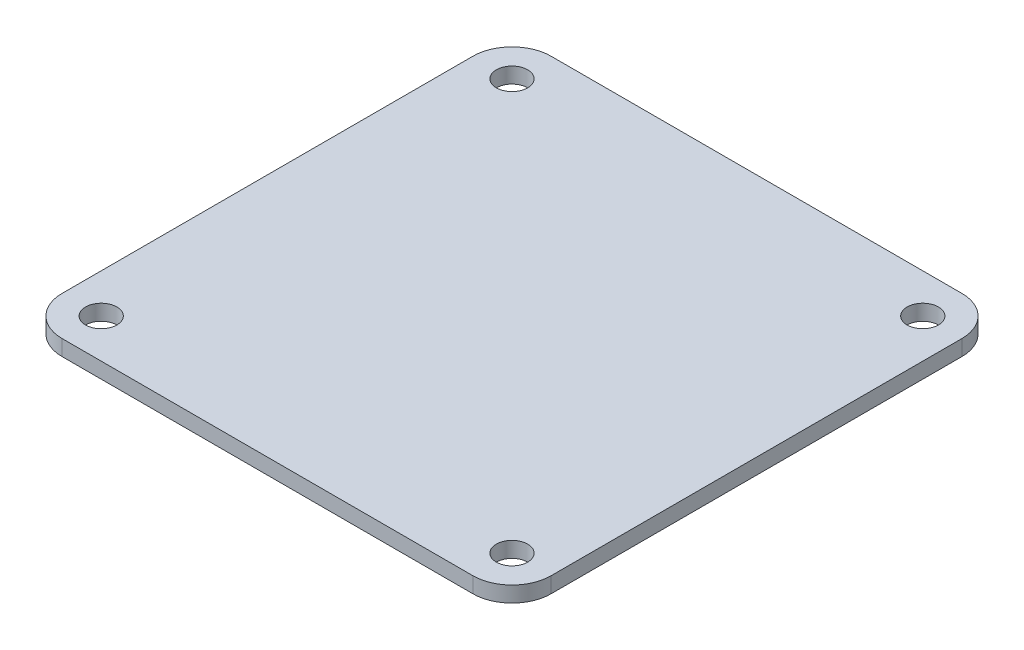
ISO-10303-21;
HEADER;
FILE_DESCRIPTION(('STEP AP214'),'2;1');
FILE_NAME('part.step','',(''),(''),'','','');
FILE_SCHEMA(('AUTOMOTIVE_DESIGN { 1 0 10303 214 1 1 1 1 }'));
ENDSEC;
DATA;
#1=APPLICATION_CONTEXT('core data for automotive mechanical design processes');
#2=APPLICATION_PROTOCOL_DEFINITION('international standard','automotive_design',2000,#1);
#3=PRODUCT_CONTEXT('',#1,'mechanical');
#4=PRODUCT('Part','Part','',(#3));
#5=PRODUCT_RELATED_PRODUCT_CATEGORY('part','',(#4));
#6=PRODUCT_DEFINITION_FORMATION('','',#4);
#7=PRODUCT_DEFINITION_CONTEXT('part definition',#1,'design');
#8=PRODUCT_DEFINITION('design','',#6,#7);
#9=PRODUCT_DEFINITION_SHAPE('','',#8);
#10=(LENGTH_UNIT() NAMED_UNIT(*) SI_UNIT(.MILLI.,.METRE.));
#11=(NAMED_UNIT(*) PLANE_ANGLE_UNIT() SI_UNIT($,.RADIAN.));
#12=(NAMED_UNIT(*) SI_UNIT($,.STERADIAN.) SOLID_ANGLE_UNIT());
#13=UNCERTAINTY_MEASURE_WITH_UNIT(LENGTH_MEASURE(1.E-05),#10,'distance_accuracy_value','');
#14=(GEOMETRIC_REPRESENTATION_CONTEXT(3) GLOBAL_UNCERTAINTY_ASSIGNED_CONTEXT((#13)) GLOBAL_UNIT_ASSIGNED_CONTEXT((#10,
#11,#12)) REPRESENTATION_CONTEXT('',''));
#15=CARTESIAN_POINT('',(0.,0.,0.));
#16=DIRECTION('',(0.,0.,1.));
#17=DIRECTION('',(1.,0.,0.));
#18=AXIS2_PLACEMENT_3D('',#15,#16,#17);
#19=CARTESIAN_POINT('',(0.,1.6,0.));
#20=DIRECTION('',(0.,-1.,0.));
#21=DIRECTION('',(0.,0.,-1.));
#22=AXIS2_PLACEMENT_3D('',#19,#20,#21);
#23=PLANE('',#22);
#24=CARTESIAN_POINT('',(-21.,1.6,-21.));
#25=DIRECTION('',(0.,1.,0.));
#26=DIRECTION('',(0.,0.,1.));
#27=AXIS2_PLACEMENT_3D('',#24,#25,#26);
#28=CIRCLE('',#27,1.6);
#29=CARTESIAN_POINT('',(-21.,1.6,-19.4));
#30=VERTEX_POINT('',#29);
#31=EDGE_CURVE('E181',#30,#30,#28,.T.);
#32=ORIENTED_EDGE('',*,*,#31,.F.);
#33=EDGE_LOOP('',(#32));
#34=FACE_BOUND('',#33,.T.);
#35=CARTESIAN_POINT('',(21.,1.6,21.));
#36=DIRECTION('',(0.,1.,0.));
#37=DIRECTION('',(0.,0.,1.));
#38=AXIS2_PLACEMENT_3D('',#35,#36,#37);
#39=CIRCLE('',#38,1.6);
#40=CARTESIAN_POINT('',(21.,1.6,22.6));
#41=VERTEX_POINT('',#40);
#42=EDGE_CURVE('E164',#41,#41,#39,.T.);
#43=ORIENTED_EDGE('',*,*,#42,.F.);
#44=EDGE_LOOP('',(#43));
#45=FACE_BOUND('',#44,.T.);
#46=DIRECTION('',(0.,0.,1.));
#47=VECTOR('',#46,1.);
#48=CARTESIAN_POINT('',(-25.,1.6,25.));
#49=LINE('',#48,#47);
#50=CARTESIAN_POINT('',(-25.,1.6,-21.));
#51=VERTEX_POINT('',#50);
#52=CARTESIAN_POINT('',(-25.,1.6,21.));
#53=VERTEX_POINT('',#52);
#54=EDGE_CURVE('E171',#51,#53,#49,.T.);
#55=ORIENTED_EDGE('',*,*,#54,.T.);
#56=CARTESIAN_POINT('',(-21.,1.6,21.));
#57=DIRECTION('',(0.,-1.,0.));
#58=DIRECTION('',(0.,0.,-1.));
#59=AXIS2_PLACEMENT_3D('',#56,#57,#58);
#60=CIRCLE('',#59,4.);
#61=CARTESIAN_POINT('',(-21.,1.6,25.));
#62=VERTEX_POINT('',#61);
#63=EDGE_CURVE('E148',#53,#62,#60,.F.);
#64=ORIENTED_EDGE('',*,*,#63,.T.);
#65=DIRECTION('',(1.,0.,0.));
#66=VECTOR('',#65,1.);
#67=CARTESIAN_POINT('',(-25.,1.6,25.));
#68=LINE('',#67,#66);
#69=CARTESIAN_POINT('',(21.,1.6,25.));
#70=VERTEX_POINT('',#69);
#71=EDGE_CURVE('E119',#62,#70,#68,.T.);
#72=ORIENTED_EDGE('',*,*,#71,.T.);
#73=CARTESIAN_POINT('',(21.,1.6,21.));
#74=DIRECTION('',(0.,-1.,0.));
#75=DIRECTION('',(0.,0.,-1.));
#76=AXIS2_PLACEMENT_3D('',#73,#74,#75);
#77=CIRCLE('',#76,4.);
#78=CARTESIAN_POINT('',(25.,1.6,21.));
#79=VERTEX_POINT('',#78);
#80=EDGE_CURVE('E143',#70,#79,#77,.F.);
#81=ORIENTED_EDGE('',*,*,#80,.T.);
#82=DIRECTION('',(0.,0.,-1.));
#83=VECTOR('',#82,1.);
#84=CARTESIAN_POINT('',(25.,1.6,25.));
#85=LINE('',#84,#83);
#86=CARTESIAN_POINT('',(25.,1.6,-21.));
#87=VERTEX_POINT('',#86);
#88=EDGE_CURVE('E126',#79,#87,#85,.T.);
#89=ORIENTED_EDGE('',*,*,#88,.T.);
#90=CARTESIAN_POINT('',(21.,1.6,-21.));
#91=DIRECTION('',(0.,-1.,0.));
#92=DIRECTION('',(0.,0.,-1.));
#93=AXIS2_PLACEMENT_3D('',#90,#91,#92);
#94=CIRCLE('',#93,4.);
#95=CARTESIAN_POINT('',(21.,1.6,-25.));
#96=VERTEX_POINT('',#95);
#97=EDGE_CURVE('E55',#87,#96,#94,.F.);
#98=ORIENTED_EDGE('',*,*,#97,.T.);
#99=DIRECTION('',(-1.,0.,0.));
#100=VECTOR('',#99,1.);
#101=CARTESIAN_POINT('',(-25.,1.6,-25.));
#102=LINE('',#101,#100);
#103=CARTESIAN_POINT('',(-21.,1.6,-25.));
#104=VERTEX_POINT('',#103);
#105=EDGE_CURVE('E129',#96,#104,#102,.T.);
#106=ORIENTED_EDGE('',*,*,#105,.T.);
#107=CARTESIAN_POINT('',(-21.,1.6,-21.));
#108=DIRECTION('',(0.,-1.,0.));
#109=DIRECTION('',(0.,0.,-1.));
#110=AXIS2_PLACEMENT_3D('',#107,#108,#109);
#111=CIRCLE('',#110,4.);
#112=EDGE_CURVE('E146',#104,#51,#111,.F.);
#113=ORIENTED_EDGE('',*,*,#112,.T.);
#114=EDGE_LOOP('',(#55,#64,#72,#81,#89,#98,#106,#113));
#115=FACE_BOUND('',#114,.T.);
#116=CARTESIAN_POINT('',(21.,1.6,-21.));
#117=DIRECTION('',(0.,1.,0.));
#118=DIRECTION('',(0.,0.,1.));
#119=AXIS2_PLACEMENT_3D('',#116,#117,#118);
#120=CIRCLE('',#119,1.6);
#121=CARTESIAN_POINT('',(21.,1.6,-19.4));
#122=VERTEX_POINT('',#121);
#123=EDGE_CURVE('E176',#122,#122,#120,.T.);
#124=ORIENTED_EDGE('',*,*,#123,.F.);
#125=EDGE_LOOP('',(#124));
#126=FACE_BOUND('',#125,.T.);
#127=CARTESIAN_POINT('',(-21.,1.6,21.));
#128=DIRECTION('',(0.,1.,0.));
#129=DIRECTION('',(0.,0.,1.));
#130=AXIS2_PLACEMENT_3D('',#127,#128,#129);
#131=CIRCLE('',#130,1.6);
#132=CARTESIAN_POINT('',(-21.,1.6,22.6));
#133=VERTEX_POINT('',#132);
#134=EDGE_CURVE('E187',#133,#133,#131,.T.);
#135=ORIENTED_EDGE('',*,*,#134,.F.);
#136=EDGE_LOOP('',(#135));
#137=FACE_BOUND('',#136,.T.);
#138=ADVANCED_FACE('F33',(#34,#45,#115,#126,#137),#23,.F.);
#139=CARTESIAN_POINT('',(0.,0.,0.));
#140=DIRECTION('',(0.,-1.,0.));
#141=DIRECTION('',(0.,0.,-1.));
#142=AXIS2_PLACEMENT_3D('',#139,#140,#141);
#143=PLANE('',#142);
#144=CARTESIAN_POINT('',(-21.,0.,-21.));
#145=DIRECTION('',(0.,1.,0.));
#146=DIRECTION('',(0.,0.,1.));
#147=AXIS2_PLACEMENT_3D('',#144,#145,#146);
#148=CIRCLE('',#147,1.6);
#149=CARTESIAN_POINT('',(-21.,0.,-19.4));
#150=VERTEX_POINT('',#149);
#151=EDGE_CURVE('E184',#150,#150,#148,.T.);
#152=ORIENTED_EDGE('',*,*,#151,.T.);
#153=EDGE_LOOP('',(#152));
#154=FACE_BOUND('',#153,.T.);
#155=CARTESIAN_POINT('',(21.,0.,21.));
#156=DIRECTION('',(0.,1.,0.));
#157=DIRECTION('',(0.,0.,1.));
#158=AXIS2_PLACEMENT_3D('',#155,#156,#157);
#159=CIRCLE('',#158,1.6);
#160=CARTESIAN_POINT('',(21.,0.,22.6));
#161=VERTEX_POINT('',#160);
#162=EDGE_CURVE('E167',#161,#161,#159,.T.);
#163=ORIENTED_EDGE('',*,*,#162,.T.);
#164=EDGE_LOOP('',(#163));
#165=FACE_BOUND('',#164,.T.);
#166=DIRECTION('',(1.,0.,0.));
#167=VECTOR('',#166,1.);
#168=CARTESIAN_POINT('',(-25.,0.,25.));
#169=LINE('',#168,#167);
#170=CARTESIAN_POINT('',(-21.,0.,25.));
#171=VERTEX_POINT('',#170);
#172=CARTESIAN_POINT('',(21.,0.,25.));
#173=VERTEX_POINT('',#172);
#174=EDGE_CURVE('E116',#171,#173,#169,.T.);
#175=ORIENTED_EDGE('',*,*,#174,.F.);
#176=CARTESIAN_POINT('',(-21.,0.,21.));
#177=DIRECTION('',(0.,-1.,0.));
#178=DIRECTION('',(0.,0.,-1.));
#179=AXIS2_PLACEMENT_3D('',#176,#177,#178);
#180=CIRCLE('',#179,4.);
#181=CARTESIAN_POINT('',(-25.,0.,21.));
#182=VERTEX_POINT('',#181);
#183=EDGE_CURVE('E99',#171,#182,#180,.T.);
#184=ORIENTED_EDGE('',*,*,#183,.T.);
#185=DIRECTION('',(0.,0.,1.));
#186=VECTOR('',#185,1.);
#187=CARTESIAN_POINT('',(-25.,0.,25.));
#188=LINE('',#187,#186);
#189=CARTESIAN_POINT('',(-25.,0.,-21.));
#190=VERTEX_POINT('',#189);
#191=EDGE_CURVE('E127',#190,#182,#188,.T.);
#192=ORIENTED_EDGE('',*,*,#191,.F.);
#193=CARTESIAN_POINT('',(-21.,0.,-21.));
#194=DIRECTION('',(0.,-1.,0.));
#195=DIRECTION('',(0.,0.,-1.));
#196=AXIS2_PLACEMENT_3D('',#193,#194,#195);
#197=CIRCLE('',#196,4.);
#198=CARTESIAN_POINT('',(-21.,0.,-25.));
#199=VERTEX_POINT('',#198);
#200=EDGE_CURVE('E110',#190,#199,#197,.T.);
#201=ORIENTED_EDGE('',*,*,#200,.T.);
#202=DIRECTION('',(-1.,0.,0.));
#203=VECTOR('',#202,1.);
#204=CARTESIAN_POINT('',(-25.,0.,-25.));
#205=LINE('',#204,#203);
#206=CARTESIAN_POINT('',(21.,0.,-25.));
#207=VERTEX_POINT('',#206);
#208=EDGE_CURVE('E131',#207,#199,#205,.T.);
#209=ORIENTED_EDGE('',*,*,#208,.F.);
#210=CARTESIAN_POINT('',(21.,0.,-21.));
#211=DIRECTION('',(0.,-1.,0.));
#212=DIRECTION('',(0.,0.,-1.));
#213=AXIS2_PLACEMENT_3D('',#210,#211,#212);
#214=CIRCLE('',#213,4.);
#215=CARTESIAN_POINT('',(25.,0.,-21.));
#216=VERTEX_POINT('',#215);
#217=EDGE_CURVE('E137',#207,#216,#214,.T.);
#218=ORIENTED_EDGE('',*,*,#217,.T.);
#219=DIRECTION('',(0.,0.,-1.));
#220=VECTOR('',#219,1.);
#221=CARTESIAN_POINT('',(25.,0.,25.));
#222=LINE('',#221,#220);
#223=CARTESIAN_POINT('',(25.,0.,21.));
#224=VERTEX_POINT('',#223);
#225=EDGE_CURVE('E159',#224,#216,#222,.T.);
#226=ORIENTED_EDGE('',*,*,#225,.F.);
#227=CARTESIAN_POINT('',(21.,0.,21.));
#228=DIRECTION('',(0.,-1.,0.));
#229=DIRECTION('',(0.,0.,-1.));
#230=AXIS2_PLACEMENT_3D('',#227,#228,#229);
#231=CIRCLE('',#230,4.);
#232=EDGE_CURVE('E120',#224,#173,#231,.T.);
#233=ORIENTED_EDGE('',*,*,#232,.T.);
#234=EDGE_LOOP('',(#175,#184,#192,#201,#209,#218,#226,#233));
#235=FACE_BOUND('',#234,.T.);
#236=CARTESIAN_POINT('',(21.,0.,-21.));
#237=DIRECTION('',(0.,1.,0.));
#238=DIRECTION('',(0.,0.,1.));
#239=AXIS2_PLACEMENT_3D('',#236,#237,#238);
#240=CIRCLE('',#239,1.6);
#241=CARTESIAN_POINT('',(21.,0.,-19.4));
#242=VERTEX_POINT('',#241);
#243=EDGE_CURVE('E178',#242,#242,#240,.T.);
#244=ORIENTED_EDGE('',*,*,#243,.T.);
#245=EDGE_LOOP('',(#244));
#246=FACE_BOUND('',#245,.T.);
#247=CARTESIAN_POINT('',(-21.,0.,21.));
#248=DIRECTION('',(0.,1.,0.));
#249=DIRECTION('',(0.,0.,1.));
#250=AXIS2_PLACEMENT_3D('',#247,#248,#249);
#251=CIRCLE('',#250,1.6);
#252=CARTESIAN_POINT('',(-21.,0.,22.6));
#253=VERTEX_POINT('',#252);
#254=EDGE_CURVE('E190',#253,#253,#251,.T.);
#255=ORIENTED_EDGE('',*,*,#254,.T.);
#256=EDGE_LOOP('',(#255));
#257=FACE_BOUND('',#256,.T.);
#258=ADVANCED_FACE('F123',(#154,#165,#235,#246,#257),#143,.T.);
#259=CARTESIAN_POINT('',(25.,1.6,25.));
#260=DIRECTION('',(-1.,0.,0.));
#261=DIRECTION('',(0.,0.,1.));
#262=AXIS2_PLACEMENT_3D('',#259,#260,#261);
#263=PLANE('',#262);
#264=ORIENTED_EDGE('',*,*,#225,.T.);
#265=DIRECTION('',(0.,-1.,0.));
#266=VECTOR('',#265,1.);
#267=CARTESIAN_POINT('',(25.,1.6,-21.));
#268=LINE('',#267,#266);
#269=EDGE_CURVE('E11',#216,#87,#268,.F.);
#270=ORIENTED_EDGE('',*,*,#269,.T.);
#271=ORIENTED_EDGE('',*,*,#88,.F.);
#272=DIRECTION('',(0.,-1.,0.));
#273=VECTOR('',#272,1.);
#274=CARTESIAN_POINT('',(25.,1.6,21.));
#275=LINE('',#274,#273);
#276=EDGE_CURVE('E41',#79,#224,#275,.T.);
#277=ORIENTED_EDGE('',*,*,#276,.T.);
#278=EDGE_LOOP('',(#264,#270,#271,#277));
#279=FACE_BOUND('',#278,.T.);
#280=ADVANCED_FACE('F158',(#279),#263,.F.);
#281=CARTESIAN_POINT('',(-25.,1.6,-25.));
#282=DIRECTION('',(0.,0.,1.));
#283=DIRECTION('',(1.,0.,0.));
#284=AXIS2_PLACEMENT_3D('',#281,#282,#283);
#285=PLANE('',#284);
#286=ORIENTED_EDGE('',*,*,#208,.T.);
#287=DIRECTION('',(0.,-1.,0.));
#288=VECTOR('',#287,1.);
#289=CARTESIAN_POINT('',(-21.,1.6,-25.));
#290=LINE('',#289,#288);
#291=EDGE_CURVE('E48',#199,#104,#290,.F.);
#292=ORIENTED_EDGE('',*,*,#291,.T.);
#293=ORIENTED_EDGE('',*,*,#105,.F.);
#294=DIRECTION('',(0.,-1.,0.));
#295=VECTOR('',#294,1.);
#296=CARTESIAN_POINT('',(21.,1.6,-25.));
#297=LINE('',#296,#295);
#298=EDGE_CURVE('E150',#96,#207,#297,.T.);
#299=ORIENTED_EDGE('',*,*,#298,.T.);
#300=EDGE_LOOP('',(#286,#292,#293,#299));
#301=FACE_BOUND('',#300,.T.);
#302=ADVANCED_FACE('F218',(#301),#285,.F.);
#303=CARTESIAN_POINT('',(-25.,1.6,25.));
#304=DIRECTION('',(1.,0.,0.));
#305=DIRECTION('',(0.,0.,-1.));
#306=AXIS2_PLACEMENT_3D('',#303,#304,#305);
#307=PLANE('',#306);
#308=ORIENTED_EDGE('',*,*,#191,.T.);
#309=DIRECTION('',(0.,-1.,0.));
#310=VECTOR('',#309,1.);
#311=CARTESIAN_POINT('',(-25.,1.6,21.));
#312=LINE('',#311,#310);
#313=EDGE_CURVE('E104',#182,#53,#312,.F.);
#314=ORIENTED_EDGE('',*,*,#313,.T.);
#315=ORIENTED_EDGE('',*,*,#54,.F.);
#316=DIRECTION('',(0.,-1.,0.));
#317=VECTOR('',#316,1.);
#318=CARTESIAN_POINT('',(-25.,1.6,-21.));
#319=LINE('',#318,#317);
#320=EDGE_CURVE('E109',#51,#190,#319,.T.);
#321=ORIENTED_EDGE('',*,*,#320,.T.);
#322=EDGE_LOOP('',(#308,#314,#315,#321));
#323=FACE_BOUND('',#322,.T.);
#324=ADVANCED_FACE('F215',(#323),#307,.F.);
#325=CARTESIAN_POINT('',(-25.,1.6,25.));
#326=DIRECTION('',(0.,0.,-1.));
#327=DIRECTION('',(-1.,0.,0.));
#328=AXIS2_PLACEMENT_3D('',#325,#326,#327);
#329=PLANE('',#328);
#330=ORIENTED_EDGE('',*,*,#71,.F.);
#331=DIRECTION('',(0.,-1.,0.));
#332=VECTOR('',#331,1.);
#333=CARTESIAN_POINT('',(-21.,1.6,25.));
#334=LINE('',#333,#332);
#335=EDGE_CURVE('E103',#62,#171,#334,.T.);
#336=ORIENTED_EDGE('',*,*,#335,.T.);
#337=ORIENTED_EDGE('',*,*,#174,.T.);
#338=DIRECTION('',(0.,-1.,0.));
#339=VECTOR('',#338,1.);
#340=CARTESIAN_POINT('',(21.,1.6,25.));
#341=LINE('',#340,#339);
#342=EDGE_CURVE('E121',#173,#70,#341,.F.);
#343=ORIENTED_EDGE('',*,*,#342,.T.);
#344=EDGE_LOOP('',(#330,#336,#337,#343));
#345=FACE_BOUND('',#344,.T.);
#346=ADVANCED_FACE('F115',(#345),#329,.F.);
#347=CARTESIAN_POINT('',(21.,1.6,21.));
#348=DIRECTION('',(0.,-1.,0.));
#349=DIRECTION('',(0.,0.,-1.));
#350=AXIS2_PLACEMENT_3D('',#347,#348,#349);
#351=CYLINDRICAL_SURFACE('',#350,1.6);
#352=ORIENTED_EDGE('',*,*,#42,.T.);
#353=EDGE_LOOP('',(#352));
#354=FACE_BOUND('',#353,.T.);
#355=ORIENTED_EDGE('',*,*,#162,.F.);
#356=EDGE_LOOP('',(#355));
#357=FACE_BOUND('',#356,.T.);
#358=ADVANCED_FACE('F210',(#354,#357),#351,.F.);
#359=CARTESIAN_POINT('',(21.,1.6,-21.));
#360=DIRECTION('',(0.,-1.,0.));
#361=DIRECTION('',(0.,0.,-1.));
#362=AXIS2_PLACEMENT_3D('',#359,#360,#361);
#363=CYLINDRICAL_SURFACE('',#362,1.6);
#364=ORIENTED_EDGE('',*,*,#123,.T.);
#365=EDGE_LOOP('',(#364));
#366=FACE_BOUND('',#365,.T.);
#367=ORIENTED_EDGE('',*,*,#243,.F.);
#368=EDGE_LOOP('',(#367));
#369=FACE_BOUND('',#368,.T.);
#370=ADVANCED_FACE('F242',(#366,#369),#363,.F.);
#371=CARTESIAN_POINT('',(-21.,1.6,-21.));
#372=DIRECTION('',(0.,-1.,0.));
#373=DIRECTION('',(0.,0.,-1.));
#374=AXIS2_PLACEMENT_3D('',#371,#372,#373);
#375=CYLINDRICAL_SURFACE('',#374,1.6);
#376=ORIENTED_EDGE('',*,*,#31,.T.);
#377=EDGE_LOOP('',(#376));
#378=FACE_BOUND('',#377,.T.);
#379=ORIENTED_EDGE('',*,*,#151,.F.);
#380=EDGE_LOOP('',(#379));
#381=FACE_BOUND('',#380,.T.);
#382=ADVANCED_FACE('F245',(#378,#381),#375,.F.);
#383=CARTESIAN_POINT('',(-21.,1.6,21.));
#384=DIRECTION('',(0.,-1.,0.));
#385=DIRECTION('',(0.,0.,-1.));
#386=AXIS2_PLACEMENT_3D('',#383,#384,#385);
#387=CYLINDRICAL_SURFACE('',#386,1.6);
#388=ORIENTED_EDGE('',*,*,#134,.T.);
#389=EDGE_LOOP('',(#388));
#390=FACE_BOUND('',#389,.T.);
#391=ORIENTED_EDGE('',*,*,#254,.F.);
#392=EDGE_LOOP('',(#391));
#393=FACE_BOUND('',#392,.T.);
#394=ADVANCED_FACE('F196',(#390,#393),#387,.F.);
#395=CARTESIAN_POINT('',(-21.,1.6,21.));
#396=DIRECTION('',(0.,-1.,0.));
#397=DIRECTION('',(0.,0.,-1.));
#398=AXIS2_PLACEMENT_3D('',#395,#396,#397);
#399=CYLINDRICAL_SURFACE('',#398,4.);
#400=ORIENTED_EDGE('',*,*,#63,.F.);
#401=ORIENTED_EDGE('',*,*,#313,.F.);
#402=ORIENTED_EDGE('',*,*,#183,.F.);
#403=ORIENTED_EDGE('',*,*,#335,.F.);
#404=EDGE_LOOP('',(#400,#401,#402,#403));
#405=FACE_BOUND('',#404,.T.);
#406=ADVANCED_FACE('F102',(#405),#399,.T.);
#407=CARTESIAN_POINT('',(-21.,1.6,-21.));
#408=DIRECTION('',(0.,-1.,0.));
#409=DIRECTION('',(0.,0.,-1.));
#410=AXIS2_PLACEMENT_3D('',#407,#408,#409);
#411=CYLINDRICAL_SURFACE('',#410,4.);
#412=ORIENTED_EDGE('',*,*,#112,.F.);
#413=ORIENTED_EDGE('',*,*,#291,.F.);
#414=ORIENTED_EDGE('',*,*,#200,.F.);
#415=ORIENTED_EDGE('',*,*,#320,.F.);
#416=EDGE_LOOP('',(#412,#413,#414,#415));
#417=FACE_BOUND('',#416,.T.);
#418=ADVANCED_FACE('F226',(#417),#411,.T.);
#419=CARTESIAN_POINT('',(21.,1.6,-21.));
#420=DIRECTION('',(0.,-1.,0.));
#421=DIRECTION('',(0.,0.,-1.));
#422=AXIS2_PLACEMENT_3D('',#419,#420,#421);
#423=CYLINDRICAL_SURFACE('',#422,4.);
#424=ORIENTED_EDGE('',*,*,#97,.F.);
#425=ORIENTED_EDGE('',*,*,#269,.F.);
#426=ORIENTED_EDGE('',*,*,#217,.F.);
#427=ORIENTED_EDGE('',*,*,#298,.F.);
#428=EDGE_LOOP('',(#424,#425,#426,#427));
#429=FACE_BOUND('',#428,.T.);
#430=ADVANCED_FACE('F228',(#429),#423,.T.);
#431=CARTESIAN_POINT('',(21.,1.6,21.));
#432=DIRECTION('',(0.,-1.,0.));
#433=DIRECTION('',(0.,0.,-1.));
#434=AXIS2_PLACEMENT_3D('',#431,#432,#433);
#435=CYLINDRICAL_SURFACE('',#434,4.);
#436=ORIENTED_EDGE('',*,*,#80,.F.);
#437=ORIENTED_EDGE('',*,*,#342,.F.);
#438=ORIENTED_EDGE('',*,*,#232,.F.);
#439=ORIENTED_EDGE('',*,*,#276,.F.);
#440=EDGE_LOOP('',(#436,#437,#438,#439));
#441=FACE_BOUND('',#440,.T.);
#442=ADVANCED_FACE('F35',(#441),#435,.T.);
#443=CLOSED_SHELL('',(#138,#258,#280,#302,#324,#346,#358,#370,#382,#394,#406,#418,#430,#442));
#444=MANIFOLD_SOLID_BREP('B2',#443);
#445=ADVANCED_BREP_SHAPE_REPRESENTATION('',(#18,#444),#14);
#446=SHAPE_DEFINITION_REPRESENTATION(#9,#445);
ENDSEC;
END-ISO-10303-21;
